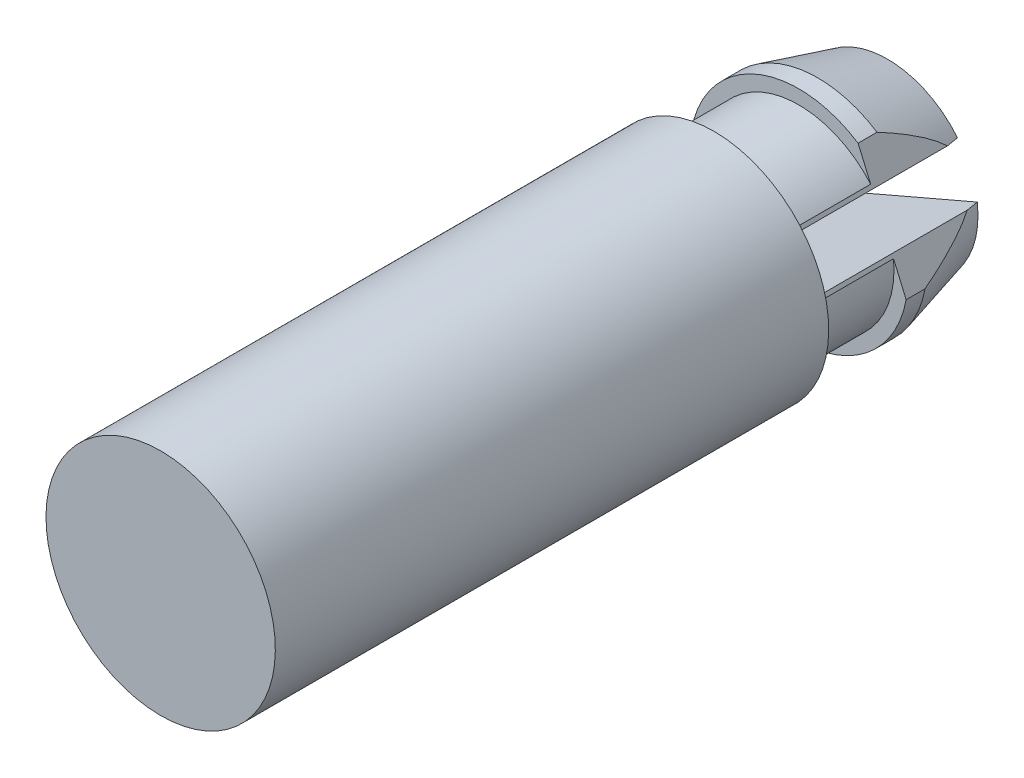
ISO-10303-21;
HEADER;
FILE_DESCRIPTION(('STEP AP214'),'2;1');
FILE_NAME('part.step','',(''),(''),'','','');
FILE_SCHEMA(('AUTOMOTIVE_DESIGN { 1 0 10303 214 1 1 1 1 }'));
ENDSEC;
DATA;
#1=APPLICATION_CONTEXT('core data for automotive mechanical design processes');
#2=APPLICATION_PROTOCOL_DEFINITION('international standard','automotive_design',2000,#1);
#3=PRODUCT_CONTEXT('',#1,'mechanical');
#4=PRODUCT('Part','Part','',(#3));
#5=PRODUCT_RELATED_PRODUCT_CATEGORY('part','',(#4));
#6=PRODUCT_DEFINITION_FORMATION('','',#4);
#7=PRODUCT_DEFINITION_CONTEXT('part definition',#1,'design');
#8=PRODUCT_DEFINITION('design','',#6,#7);
#9=PRODUCT_DEFINITION_SHAPE('','',#8);
#10=(LENGTH_UNIT() NAMED_UNIT(*) SI_UNIT(.MILLI.,.METRE.));
#11=(NAMED_UNIT(*) PLANE_ANGLE_UNIT() SI_UNIT($,.RADIAN.));
#12=(NAMED_UNIT(*) SI_UNIT($,.STERADIAN.) SOLID_ANGLE_UNIT());
#13=UNCERTAINTY_MEASURE_WITH_UNIT(LENGTH_MEASURE(1.E-05),#10,'distance_accuracy_value','');
#14=(GEOMETRIC_REPRESENTATION_CONTEXT(3) GLOBAL_UNCERTAINTY_ASSIGNED_CONTEXT((#13)) GLOBAL_UNIT_ASSIGNED_CONTEXT((#10,
#11,#12)) REPRESENTATION_CONTEXT('',''));
#15=CARTESIAN_POINT('',(0.,0.,0.));
#16=DIRECTION('',(0.,0.,1.));
#17=DIRECTION('',(1.,0.,0.));
#18=AXIS2_PLACEMENT_3D('',#15,#16,#17);
#19=CARTESIAN_POINT('',(73.0951711620178,71.9465523601488,37.7358601149983));
#20=DIRECTION('',(0.,0.,1.));
#21=DIRECTION('',(1.,0.,0.));
#22=AXIS2_PLACEMENT_3D('',#19,#20,#21);
#23=PLANE('',#22);
#24=CARTESIAN_POINT('',(74.3116465105009,75.0052499991012,37.7358601149983));
#25=DIRECTION('',(0.,0.,1.));
#26=DIRECTION('',(0.918365051433991,0.395734295082752,0.));
#27=AXIS2_PLACEMENT_3D('',#24,#25,#26);
#28=CIRCLE('',#27,1.91);
#29=CARTESIAN_POINT('',(75.7537839423966,76.2575836718213,37.7358601149983));
#30=VERTEX_POINT('',#29);
#31=CARTESIAN_POINT('',(72.4109351551768,74.8171108377201,37.7358601149983));
#32=VERTEX_POINT('',#31);
#33=EDGE_CURVE('E240',#30,#32,#28,.T.);
#34=ORIENTED_EDGE('',*,*,#33,.T.);
#35=DIRECTION('',(0.395734295082752,-0.918365051433991,0.));
#36=VECTOR('',#35,1.);
#37=CARTESIAN_POINT('',(73.3417941705216,72.6569028443085,37.7358601149983));
#38=LINE('',#37,#36);
#39=CARTESIAN_POINT('',(72.8695090786053,73.7529163263811,37.7358601149983));
#40=VERTEX_POINT('',#39);
#41=EDGE_CURVE('E183',#32,#40,#38,.T.);
#42=ORIENTED_EDGE('',*,*,#41,.T.);
#43=CARTESIAN_POINT('',(74.3116465105009,75.0052499991012,37.7358601149983));
#44=DIRECTION('',(0.,0.,1.));
#45=DIRECTION('',(0.918365051433991,0.395734295082752,0.));
#46=AXIS2_PLACEMENT_3D('',#43,#44,#45);
#47=CIRCLE('',#46,1.91);
#48=CARTESIAN_POINT('',(76.2123578658251,75.1933891604823,37.7358601149983));
#49=VERTEX_POINT('',#48);
#50=EDGE_CURVE('E219',#40,#49,#47,.T.);
#51=ORIENTED_EDGE('',*,*,#50,.T.);
#52=DIRECTION('',(-0.395734295082752,0.918365051433991,0.));
#53=VECTOR('',#52,1.);
#54=CARTESIAN_POINT('',(76.6846429577413,74.0973756784097,37.7358601149983));
#55=LINE('',#54,#53);
#56=EDGE_CURVE('E159',#49,#30,#55,.T.);
#57=ORIENTED_EDGE('',*,*,#56,.T.);
#58=EDGE_LOOP('',(#34,#42,#51,#57));
#59=FACE_BOUND('',#58,.T.);
#60=CARTESIAN_POINT('',(74.3116465105009,75.0052499991012,37.7358601149983));
#61=DIRECTION('',(0.,0.,-1.));
#62=DIRECTION('',(-0.918365051433992,-0.395734295082751,0.));
#63=AXIS2_PLACEMENT_3D('',#60,#61,#62);
#64=CIRCLE('',#63,2.3);
#65=CARTESIAN_POINT('',(76.4238861287991,75.9154388777915,37.7358601149983));
#66=VERTEX_POINT('',#65);
#67=EDGE_CURVE('E11',#66,#66,#64,.T.);
#68=ORIENTED_EDGE('',*,*,#67,.T.);
#69=EDGE_LOOP('',(#68));
#70=FACE_BOUND('',#69,.T.);
#71=ADVANCED_FACE('F17',(#59,#70),#23,.F.);
#72=CARTESIAN_POINT('',(73.0951711620179,71.946552360149,48.8358601149984));
#73=DIRECTION('',(0.,0.,1.));
#74=DIRECTION('',(1.,0.,0.));
#75=AXIS2_PLACEMENT_3D('',#72,#73,#74);
#76=PLANE('',#75);
#77=CARTESIAN_POINT('',(74.3116465105011,75.0052499991013,48.8358601149983));
#78=DIRECTION('',(0.,0.,1.));
#79=DIRECTION('',(-0.918365051433992,-0.395734295082751,0.));
#80=AXIS2_PLACEMENT_3D('',#77,#78,#79);
#81=CIRCLE('',#80,2.3);
#82=CARTESIAN_POINT('',(76.4238861287993,75.9154388777917,48.8358601149983));
#83=VERTEX_POINT('',#82);
#84=EDGE_CURVE('E28',#83,#83,#81,.T.);
#85=ORIENTED_EDGE('',*,*,#84,.T.);
#86=EDGE_LOOP('',(#85));
#87=FACE_BOUND('',#86,.T.);
#88=ADVANCED_FACE('F595',(#87),#76,.T.);
#89=CARTESIAN_POINT('',(74.3116465105011,75.0052499991013,48.8358601149983));
#90=DIRECTION('',(0.,0.,-1.));
#91=DIRECTION('',(-0.918365051433992,-0.395734295082751,0.));
#92=AXIS2_PLACEMENT_3D('',#89,#90,#91);
#93=CYLINDRICAL_SURFACE('',#92,2.3);
#94=ORIENTED_EDGE('',*,*,#67,.F.);
#95=EDGE_LOOP('',(#94));
#96=FACE_BOUND('',#95,.T.);
#97=ORIENTED_EDGE('',*,*,#84,.F.);
#98=EDGE_LOOP('',(#97));
#99=FACE_BOUND('',#98,.T.);
#100=ADVANCED_FACE('F554',(#96,#99),#93,.T.);
#101=CARTESIAN_POINT('',(75.864350615586,76.000995931582,37.5258601149983));
#102=DIRECTION('',(-0.918365051433991,-0.395734295082752,0.));
#103=DIRECTION('',(0.,0.,1.));
#104=AXIS2_PLACEMENT_3D('',#101,#102,#103);
#105=CYLINDRICAL_SURFACE('',#104,0.2);
#106=DIRECTION('',(-0.918365051433992,-0.395734295082751,0.));
#107=VECTOR('',#106,1.);
#108=CARTESIAN_POINT('',(74.1929262219761,75.2807595145314,37.7258601149983));
#109=LINE('',#108,#107);
#110=CARTESIAN_POINT('',(75.864350615586,76.000995931582,37.7258601149983));
#111=VERTEX_POINT('',#110);
#112=CARTESIAN_POINT('',(72.5215018283663,74.5605230974808,37.7258601149983));
#113=VERTEX_POINT('',#112);
#114=EDGE_CURVE('E125',#111,#113,#109,.T.);
#115=ORIENTED_EDGE('',*,*,#114,.T.);
#116=CARTESIAN_POINT('',(72.5215018283663,74.5605230974808,37.5258601149983));
#117=DIRECTION('',(-0.918365051433991,-0.395734295082752,0.));
#118=DIRECTION('',(0.,0.,1.));
#119=AXIS2_PLACEMENT_3D('',#116,#117,#118);
#120=CIRCLE('',#119,0.2);
#121=CARTESIAN_POINT('',(72.4423549695549,74.7441961072913,37.5258601149983));
#122=VERTEX_POINT('',#121);
#123=EDGE_CURVE('E147',#113,#122,#120,.T.);
#124=ORIENTED_EDGE('',*,*,#123,.T.);
#125=DIRECTION('',(0.918365051433992,0.395734295082751,0.));
#126=VECTOR('',#125,1.);
#127=CARTESIAN_POINT('',(74.1137793629596,75.4644325248182,37.5258601149983));
#128=LINE('',#127,#126);
#129=CARTESIAN_POINT('',(75.7852037567746,76.1846689413926,37.5258601149983));
#130=VERTEX_POINT('',#129);
#131=EDGE_CURVE('E21',#122,#130,#128,.T.);
#132=ORIENTED_EDGE('',*,*,#131,.T.);
#133=CARTESIAN_POINT('',(75.864350615586,76.000995931582,37.5258601149983));
#134=DIRECTION('',(0.918365051433991,0.395734295082752,0.));
#135=DIRECTION('',(0.,0.,1.));
#136=AXIS2_PLACEMENT_3D('',#133,#134,#135);
#137=CIRCLE('',#136,0.2);
#138=EDGE_CURVE('E327',#130,#111,#137,.T.);
#139=ORIENTED_EDGE('',*,*,#138,.T.);
#140=EDGE_LOOP('',(#115,#124,#132,#139));
#141=FACE_BOUND('',#140,.T.);
#142=ADVANCED_FACE('F148',(#141),#105,.F.);
#143=CARTESIAN_POINT('',(76.1017911926356,75.4499769007216,37.7258601149983));
#144=DIRECTION('',(0.,0.,1.));
#145=DIRECTION('',(1.,0.,0.));
#146=AXIS2_PLACEMENT_3D('',#143,#144,#145);
#147=PLANE('',#146);
#148=DIRECTION('',(-0.395734295082751,0.918365051433992,0.));
#149=VECTOR('',#148,1.);
#150=CARTESIAN_POINT('',(75.9830709041108,75.7254864161518,37.7258601149983));
#151=LINE('',#150,#149);
#152=CARTESIAN_POINT('',(76.1017911926509,75.4499769006863,37.7258601149983));
#153=VERTEX_POINT('',#152);
#154=EDGE_CURVE('E323',#153,#111,#151,.T.);
#155=ORIENTED_EDGE('',*,*,#154,.F.);
#156=DIRECTION('',(0.918365051433992,0.395734295082751,0.));
#157=VECTOR('',#156,1.);
#158=CARTESIAN_POINT('',(74.4303667990562,74.7297404836004,37.7258601149983));
#159=LINE('',#158,#157);
#160=CARTESIAN_POINT('',(72.7589424054311,74.0095040665851,37.7258601149983));
#161=VERTEX_POINT('',#160);
#162=EDGE_CURVE('E244',#161,#153,#159,.T.);
#163=ORIENTED_EDGE('',*,*,#162,.F.);
#164=DIRECTION('',(0.395734295082751,-0.918365051433992,0.));
#165=VECTOR('',#164,1.);
#166=CARTESIAN_POINT('',(72.6402221168911,74.2850135820506,37.7258601149983));
#167=LINE('',#166,#165);
#168=EDGE_CURVE('E152',#113,#161,#167,.T.);
#169=ORIENTED_EDGE('',*,*,#168,.F.);
#170=ORIENTED_EDGE('',*,*,#114,.F.);
#171=EDGE_LOOP('',(#155,#163,#169,#170));
#172=FACE_BOUND('',#171,.T.);
#173=ADVANCED_FACE('F437',(#172),#147,.F.);
#174=CARTESIAN_POINT('',(75.7852037565694,76.1846689418688,37.5258601149983));
#175=DIRECTION('',(-0.395734295082752,0.918365051433991,0.));
#176=DIRECTION('',(0.,0.,1.));
#177=AXIS2_PLACEMENT_3D('',#174,#175,#176);
#178=PLANE('',#177);
#179=CARTESIAN_POINT('',(75.7852037570063,76.1846689414923,34.5266614071802));
#180=CARTESIAN_POINT('',(75.7621657782217,76.1747416062115,34.436384510564));
#181=CARTESIAN_POINT('',(75.7390968250467,76.1648009231369,34.3461169774079));
#182=CARTESIAN_POINT('',(75.7159927375387,76.1548451002654,34.2558601148737));
#183=(BOUNDED_CURVE() B_SPLINE_CURVE(3,(#179,#180,#181,#182),.UNSPECIFIED.,.F.,
.F.) B_SPLINE_CURVE_WITH_KNOTS((4,4),(9.03997541306872E-13,0.00028109245218172),
.UNSPECIFIED.) CURVE() GEOMETRIC_REPRESENTATION_ITEM() RATIONAL_B_SPLINE_CURVE((1.,1.,1.,1.)) REPRESENTATION_ITEM(''));
#184=CARTESIAN_POINT('',(75.7852037567647,76.184668941628,34.5266614067923));
#185=VERTEX_POINT('',#184);
#186=CARTESIAN_POINT('',(75.7159927375387,76.1548451002654,34.2558601148737));
#187=VERTEX_POINT('',#186);
#188=EDGE_CURVE('E201',#185,#187,#183,.T.);
#189=ORIENTED_EDGE('',*,*,#188,.F.);
#190=DIRECTION('',(0.,0.,1.));
#191=VECTOR('',#190,1.);
#192=CARTESIAN_POINT('',(75.7852037569799,76.1846689409163,36.1216331644983));
#193=LINE('',#192,#191);
#194=EDGE_CURVE('E142',#185,#130,#193,.T.);
#195=ORIENTED_EDGE('',*,*,#194,.T.);
#196=ORIENTED_EDGE('',*,*,#131,.F.);
#197=DIRECTION('',(0.,0.,-1.));
#198=VECTOR('',#197,1.);
#199=CARTESIAN_POINT('',(72.4423549697601,74.7441961068151,36.1216331644983));
#200=LINE('',#199,#198);
#201=CARTESIAN_POINT('',(72.4423549693934,74.7441961074523,34.5266614067876));
#202=VERTEX_POINT('',#201);
#203=EDGE_CURVE('E139',#122,#202,#200,.T.);
#204=ORIENTED_EDGE('',*,*,#203,.T.);
#205=CARTESIAN_POINT('',(72.511565988379,74.7740199493704,34.255860114879));
#206=CARTESIAN_POINT('',(72.4884619012034,74.764064126303,34.3461169774823));
#207=CARTESIAN_POINT('',(72.4653929476946,74.7541234434237,34.4363845105746));
#208=CARTESIAN_POINT('',(72.4423549693219,74.7441961071909,34.5266614071856));
#209=(BOUNDED_CURVE() B_SPLINE_CURVE(3,(#205,#206,#207,#208),.UNSPECIFIED.,.F.,
.F.) B_SPLINE_CURVE_WITH_KNOTS((4,4),(1.23741821726329E-13,0.00028109245138149),
.UNSPECIFIED.) CURVE() GEOMETRIC_REPRESENTATION_ITEM() RATIONAL_B_SPLINE_CURVE((1.,1.,1.,1.)) REPRESENTATION_ITEM(''));
#210=CARTESIAN_POINT('',(72.511565988379,74.7740199493704,34.255860114879));
#211=VERTEX_POINT('',#210);
#212=EDGE_CURVE('E278',#211,#202,#209,.T.);
#213=ORIENTED_EDGE('',*,*,#212,.F.);
#214=DIRECTION('',(-0.918365051433992,-0.395734295082751,0.));
#215=VECTOR('',#214,1.);
#216=CARTESIAN_POINT('',(74.1137793629595,75.4644325248182,34.2558601149983));
#217=LINE('',#216,#215);
#218=EDGE_CURVE('E145',#187,#211,#217,.T.);
#219=ORIENTED_EDGE('',*,*,#218,.F.);
#220=EDGE_LOOP('',(#189,#195,#196,#204,#213,#219));
#221=FACE_BOUND('',#220,.T.);
#222=ADVANCED_FACE('F136',(#221),#178,.F.);
#223=CARTESIAN_POINT('',(75.7352192976308,76.1631300509971,34.2558601149983));
#224=DIRECTION('',(0.,0.,-1.));
#225=DIRECTION('',(-1.,0.,0.));
#226=AXIS2_PLACEMENT_3D('',#223,#224,#225);
#227=PLANE('',#226);
#228=CARTESIAN_POINT('',(74.3116465105009,75.0052499991012,34.2558601149983));
#229=DIRECTION('',(0.,0.,-1.));
#230=DIRECTION('',(0.918365051433992,0.395734295082751,0.));
#231=AXIS2_PLACEMENT_3D('',#228,#229,#230);
#232=CIRCLE('',#231,1.814871131);
#233=EDGE_CURVE('E225',#211,#187,#232,.T.);
#234=ORIENTED_EDGE('',*,*,#233,.T.);
#235=ORIENTED_EDGE('',*,*,#218,.T.);
#236=EDGE_LOOP('',(#234,#235));
#237=FACE_BOUND('',#236,.T.);
#238=ADVANCED_FACE('F536',(#237),#227,.T.);
#239=CARTESIAN_POINT('',(76.1017911926356,75.4499769007216,37.5258601149983));
#240=DIRECTION('',(-0.918365051433991,-0.395734295082752,0.));
#241=DIRECTION('',(0.,0.,1.));
#242=AXIS2_PLACEMENT_3D('',#239,#240,#241);
#243=CYLINDRICAL_SURFACE('',#242,0.2);
#244=DIRECTION('',(-0.918365051433992,-0.395734295082751,0.));
#245=VECTOR('',#244,1.);
#246=CARTESIAN_POINT('',(74.5095136580423,74.5460674733842,37.5258601149983));
#247=LINE('',#246,#245);
#248=CARTESIAN_POINT('',(76.1809380516522,75.2663038904348,37.5258601149983));
#249=VERTEX_POINT('',#248);
#250=CARTESIAN_POINT('',(72.8380892644325,73.8258310563336,37.5258601149983));
#251=VERTEX_POINT('',#250);
#252=EDGE_CURVE('E193',#249,#251,#247,.T.);
#253=ORIENTED_EDGE('',*,*,#252,.T.);
#254=CARTESIAN_POINT('',(72.7589424054159,74.0095040666204,37.5258601149983));
#255=DIRECTION('',(-0.918365051433991,-0.395734295082752,0.));
#256=DIRECTION('',(0.,0.,1.));
#257=AXIS2_PLACEMENT_3D('',#254,#255,#256);
#258=CIRCLE('',#257,0.2);
#259=EDGE_CURVE('E179',#251,#161,#258,.T.);
#260=ORIENTED_EDGE('',*,*,#259,.T.);
#261=ORIENTED_EDGE('',*,*,#162,.T.);
#262=CARTESIAN_POINT('',(76.1017911926356,75.4499769007216,37.5258601149983));
#263=DIRECTION('',(0.918365051433991,0.395734295082752,0.));
#264=DIRECTION('',(0.,0.,1.));
#265=AXIS2_PLACEMENT_3D('',#262,#263,#264);
#266=CIRCLE('',#265,0.2);
#267=EDGE_CURVE('E328',#153,#249,#266,.T.);
#268=ORIENTED_EDGE('',*,*,#267,.T.);
#269=EDGE_LOOP('',(#253,#260,#261,#268));
#270=FACE_BOUND('',#269,.T.);
#271=ADVANCED_FACE('F434',(#270),#243,.F.);
#272=CARTESIAN_POINT('',(73.1222550789175,73.1663786002841,37.7358601149983));
#273=DIRECTION('',(0.918365051433991,0.395734295082752,0.));
#274=DIRECTION('',(0.,0.,-1.));
#275=AXIS2_PLACEMENT_3D('',#272,#273,#274);
#276=PLANE('',#275);
#277=CARTESIAN_POINT('',(72.1581891548225,75.4036485639151,35.6558601142926));
#278=CARTESIAN_POINT('',(72.3108153948691,75.0494548371335,34.8552851618377));
#279=CARTESIAN_POINT('',(72.4423549690983,74.744196108351,34.5266614059917));
#280=(BOUNDED_CURVE() B_SPLINE_CURVE(2,(#277,#278,#279),.UNSPECIFIED.,.F.,
.F.) B_SPLINE_CURVE_WITH_KNOTS((3,3),(0.197149228097952,0.369287785765568),
.UNSPECIFIED.) CURVE() GEOMETRIC_REPRESENTATION_ITEM() RATIONAL_B_SPLINE_CURVE((1.20580636210175,
1.27395615809123,1.30421363296841)) REPRESENTATION_ITEM(''));
#281=CARTESIAN_POINT('',(72.1581891548646,75.4036485638171,35.655860114344));
#282=VERTEX_POINT('',#281);
#283=EDGE_CURVE('E156',#282,#202,#280,.T.);
#284=ORIENTED_EDGE('',*,*,#283,.T.);
#285=ORIENTED_EDGE('',*,*,#203,.F.);
#286=ORIENTED_EDGE('',*,*,#123,.F.);
#287=ORIENTED_EDGE('',*,*,#168,.T.);
#288=ORIENTED_EDGE('',*,*,#259,.F.);
#289=DIRECTION('',(0.,0.,-1.));
#290=VECTOR('',#289,1.);
#291=CARTESIAN_POINT('',(72.8380892644324,73.8258310563336,35.8908601149983));
#292=LINE('',#291,#290);
#293=CARTESIAN_POINT('',(72.8380892646062,73.8258310559302,34.526661405798));
#294=VERTEX_POINT('',#293);
#295=EDGE_CURVE('E205',#251,#294,#292,.T.);
#296=ORIENTED_EDGE('',*,*,#295,.T.);
#297=CARTESIAN_POINT('',(73.1222550790085,73.1663786000729,35.6558601145482));
#298=CARTESIAN_POINT('',(72.9696288388929,73.5205723270142,34.8552851616767));
#299=CARTESIAN_POINT('',(72.838089264612,73.8258310559169,34.5266614058123));
#300=(BOUNDED_CURVE() B_SPLINE_CURVE(2,(#297,#298,#299),.UNSPECIFIED.,.F.,
.F.) B_SPLINE_CURVE_WITH_KNOTS((3,3),(-0.81633576723133,-0.644197209523718),
.UNSPECIFIED.) CURVE() GEOMETRIC_REPRESENTATION_ITEM() RATIONAL_B_SPLINE_CURVE((1.20580636208115,
1.27395615810571,1.30421363298533)) REPRESENTATION_ITEM(''));
#301=CARTESIAN_POINT('',(73.1222550794408,73.1663785997977,35.6558601143441));
#302=VERTEX_POINT('',#301);
#303=EDGE_CURVE('E301',#302,#294,#300,.T.);
#304=ORIENTED_EDGE('',*,*,#303,.F.);
#305=DIRECTION('',(0.,0.,-1.));
#306=VECTOR('',#305,1.);
#307=CARTESIAN_POINT('',(73.1222550789175,73.1663786002841,36.1216331644983));
#308=LINE('',#307,#306);
#309=CARTESIAN_POINT('',(73.1222550790059,73.166378600079,36.0358601147895));
#310=VERTEX_POINT('',#309);
#311=EDGE_CURVE('E173',#310,#302,#308,.T.);
#312=ORIENTED_EDGE('',*,*,#311,.F.);
#313=DIRECTION('',(0.395734295082751,-0.918365051433992,0.));
#314=VECTOR('',#313,1.);
#315=CARTESIAN_POINT('',(72.6402221168911,74.2850135820506,36.0358601145807));
#316=LINE('',#315,#314);
#317=CARTESIAN_POINT('',(72.8695090786053,73.7529163263811,36.0358601147895));
#318=VERTEX_POINT('',#317);
#319=EDGE_CURVE('E295',#318,#310,#316,.T.);
#320=ORIENTED_EDGE('',*,*,#319,.F.);
#321=DIRECTION('',(0.,0.,-1.));
#322=VECTOR('',#321,1.);
#323=CARTESIAN_POINT('',(72.8695090787088,73.7529163261408,36.1216331644983));
#324=LINE('',#323,#322);
#325=EDGE_CURVE('E232',#40,#318,#324,.T.);
#326=ORIENTED_EDGE('',*,*,#325,.F.);
#327=ORIENTED_EDGE('',*,*,#41,.F.);
#328=DIRECTION('',(0.,0.,1.));
#329=VECTOR('',#328,1.);
#330=CARTESIAN_POINT('',(72.4109351550733,74.8171108379604,36.1216331644983));
#331=LINE('',#330,#329);
#332=CARTESIAN_POINT('',(72.4109351551768,74.8171108377201,36.0358601147895));
#333=VERTEX_POINT('',#332);
#334=EDGE_CURVE('E237',#333,#32,#331,.T.);
#335=ORIENTED_EDGE('',*,*,#334,.F.);
#336=DIRECTION('',(0.395734295082751,-0.918365051433992,0.));
#337=VECTOR('',#336,1.);
#338=CARTESIAN_POINT('',(72.6402221168911,74.2850135820506,36.0358601145807));
#339=LINE('',#338,#337);
#340=CARTESIAN_POINT('',(72.1581891547763,75.4036485640222,36.0358601147895));
#341=VERTEX_POINT('',#340);
#342=EDGE_CURVE('E315',#341,#333,#339,.T.);
#343=ORIENTED_EDGE('',*,*,#342,.F.);
#344=DIRECTION('',(0.,0.,1.));
#345=VECTOR('',#344,1.);
#346=CARTESIAN_POINT('',(72.1581891548646,75.4036485638171,36.1216331644983));
#347=LINE('',#346,#345);
#348=EDGE_CURVE('E249',#282,#341,#347,.T.);
#349=ORIENTED_EDGE('',*,*,#348,.F.);
#350=EDGE_LOOP('',(#284,#285,#286,#287,#288,#296,#304,#312,#320,#326,#327,#335,#343,#349));
#351=FACE_BOUND('',#350,.T.);
#352=ADVANCED_FACE('F154',(#351),#276,.F.);
#353=CARTESIAN_POINT('',(76.4651038661372,74.6068514343853,34.5074062139983));
#354=DIRECTION('',(-0.918365051433991,-0.395734295082752,0.));
#355=DIRECTION('',(-0.395734295082752,0.918365051433991,0.));
#356=AXIS2_PLACEMENT_3D('',#353,#354,#355);
#357=PLANE('',#356);
#358=CARTESIAN_POINT('',(76.1809380520193,75.2663038895828,34.5266614062808));
#359=CARTESIAN_POINT('',(76.3124776262118,74.9610451608854,34.8552851622139));
#360=CARTESIAN_POINT('',(76.465103866213,74.6068514342095,35.6558601144686));
#361=(BOUNDED_CURVE() B_SPLINE_CURVE(2,(#358,#359,#360),.UNSPECIFIED.,.F.,
.F.) B_SPLINE_CURVE_WITH_KNOTS((3,3),(-0.36928778563948,-0.197149228080047),
.UNSPECIFIED.) CURVE() GEOMETRIC_REPRESENTATION_ITEM() RATIONAL_B_SPLINE_CURVE((1.30421363294116,
1.27395615805739,1.20580636208757)) REPRESENTATION_ITEM(''));
#362=CARTESIAN_POINT('',(76.1809380520823,75.2663038901437,34.5266614068034));
#363=VERTEX_POINT('',#362);
#364=CARTESIAN_POINT('',(76.4651038661413,74.6068514343759,35.6558601145559));
#365=VERTEX_POINT('',#364);
#366=EDGE_CURVE('E261',#363,#365,#361,.T.);
#367=ORIENTED_EDGE('',*,*,#366,.F.);
#368=DIRECTION('',(0.,0.,1.));
#369=VECTOR('',#368,1.);
#370=CARTESIAN_POINT('',(76.1809380516522,75.2663038904348,35.8908601149983));
#371=LINE('',#370,#369);
#372=EDGE_CURVE('E189',#363,#249,#371,.T.);
#373=ORIENTED_EDGE('',*,*,#372,.T.);
#374=ORIENTED_EDGE('',*,*,#267,.F.);
#375=ORIENTED_EDGE('',*,*,#154,.T.);
#376=ORIENTED_EDGE('',*,*,#138,.F.);
#377=ORIENTED_EDGE('',*,*,#194,.F.);
#378=CARTESIAN_POINT('',(75.785203756308,76.1846689424753,34.5266614060166));
#379=CARTESIAN_POINT('',(75.6536641820832,76.4899276712477,34.8552851618671));
#380=CARTESIAN_POINT('',(75.5010379420421,76.8441213980163,35.6558601142925));
#381=(BOUNDED_CURVE() B_SPLINE_CURVE(2,(#378,#379,#380),.UNSPECIFIED.,.F.,
.F.) B_SPLINE_CURVE_WITH_KNOTS((3,3),(0.644197209637491,0.816335767205345),
.UNSPECIFIED.) CURVE() GEOMETRIC_REPRESENTATION_ITEM() RATIONAL_B_SPLINE_CURVE((1.30421363296606,
1.27395615808858,1.20580636210175)) REPRESENTATION_ITEM(''));
#382=CARTESIAN_POINT('',(75.5010379420844,76.8441213979183,35.655860114344));
#383=VERTEX_POINT('',#382);
#384=EDGE_CURVE('E192',#185,#383,#381,.T.);
#385=ORIENTED_EDGE('',*,*,#384,.T.);
#386=DIRECTION('',(0.,0.,-1.));
#387=VECTOR('',#386,1.);
#388=CARTESIAN_POINT('',(75.5010379420844,76.8441213979183,36.1216331644983));
#389=LINE('',#388,#387);
#390=CARTESIAN_POINT('',(75.501037941996,76.8441213981234,36.0358601147895));
#391=VERTEX_POINT('',#390);
#392=EDGE_CURVE('E213',#391,#383,#389,.T.);
#393=ORIENTED_EDGE('',*,*,#392,.F.);
#394=DIRECTION('',(-0.395734295082751,0.918365051433992,0.));
#395=VECTOR('',#394,1.);
#396=CARTESIAN_POINT('',(75.9830709041108,75.7254864161518,36.0358601145807));
#397=LINE('',#396,#395);
#398=CARTESIAN_POINT('',(75.7537839423966,76.2575836718213,36.0358601147895));
#399=VERTEX_POINT('',#398);
#400=EDGE_CURVE('E187',#399,#391,#397,.T.);
#401=ORIENTED_EDGE('',*,*,#400,.F.);
#402=DIRECTION('',(0.,0.,-1.));
#403=VECTOR('',#402,1.);
#404=CARTESIAN_POINT('',(75.753783942293,76.2575836720616,36.1216331644983));
#405=LINE('',#404,#403);
#406=EDGE_CURVE('E178',#30,#399,#405,.T.);
#407=ORIENTED_EDGE('',*,*,#406,.F.);
#408=ORIENTED_EDGE('',*,*,#56,.F.);
#409=DIRECTION('',(0.,0.,1.));
#410=VECTOR('',#409,1.);
#411=CARTESIAN_POINT('',(76.2123578659286,75.193389160242,36.1216331644983));
#412=LINE('',#411,#410);
#413=CARTESIAN_POINT('',(76.212357865825,75.1933891604823,36.0358601147895));
#414=VERTEX_POINT('',#413);
#415=EDGE_CURVE('E216',#414,#49,#412,.T.);
#416=ORIENTED_EDGE('',*,*,#415,.F.);
#417=DIRECTION('',(-0.395734295082751,0.918365051433992,0.));
#418=VECTOR('',#417,1.);
#419=CARTESIAN_POINT('',(75.9830709041108,75.7254864161518,36.0358601145807));
#420=LINE('',#419,#418);
#421=CARTESIAN_POINT('',(76.4651038662256,74.6068514341802,36.0358601147895));
#422=VERTEX_POINT('',#421);
#423=EDGE_CURVE('E277',#422,#414,#420,.T.);
#424=ORIENTED_EDGE('',*,*,#423,.F.);
#425=DIRECTION('',(0.,0.,1.));
#426=VECTOR('',#425,1.);
#427=CARTESIAN_POINT('',(76.4651038661372,74.6068514343853,36.1216331644983));
#428=LINE('',#427,#426);
#429=EDGE_CURVE('E170',#365,#422,#428,.T.);
#430=ORIENTED_EDGE('',*,*,#429,.F.);
#431=EDGE_LOOP('',(#367,#373,#374,#375,#376,#377,#385,#393,#401,#407,#408,#416,#424,#430));
#432=FACE_BOUND('',#431,.T.);
#433=ADVANCED_FACE('F384',(#432),#357,.F.);
#434=CARTESIAN_POINT('',(74.3116465105009,75.0052499991012,34.2558601149983));
#435=DIRECTION('',(0.,0.,1.));
#436=DIRECTION('',(0.918365051433991,0.395734295082752,0.));
#437=AXIS2_PLACEMENT_3D('',#434,#435,#436);
#438=CONICAL_SURFACE('',#437,1.814871131,0.261799387530194);
#439=CARTESIAN_POINT('',(74.3116465105009,75.0052499991012,35.6558601149983));
#440=DIRECTION('',(0.,0.,-1.));
#441=DIRECTION('',(0.918365051433991,0.395734295082752,0.));
#442=AXIS2_PLACEMENT_3D('',#439,#440,#441);
#443=CIRCLE('',#442,2.19);
#444=EDGE_CURVE('E262',#282,#383,#443,.T.);
#445=ORIENTED_EDGE('',*,*,#444,.T.);
#446=ORIENTED_EDGE('',*,*,#384,.F.);
#447=ORIENTED_EDGE('',*,*,#188,.T.);
#448=ORIENTED_EDGE('',*,*,#233,.F.);
#449=ORIENTED_EDGE('',*,*,#212,.T.);
#450=ORIENTED_EDGE('',*,*,#283,.F.);
#451=EDGE_LOOP('',(#445,#446,#447,#448,#449,#450));
#452=FACE_BOUND('',#451,.T.);
#453=ADVANCED_FACE('F564',(#452),#438,.T.);
#454=CARTESIAN_POINT('',(76.1809380516522,75.2663038904348,37.5258601149983));
#455=DIRECTION('',(0.395734295082752,-0.918365051433991,0.));
#456=DIRECTION('',(0.,0.,-1.));
#457=AXIS2_PLACEMENT_3D('',#454,#455,#456);
#458=PLANE('',#457);
#459=CARTESIAN_POINT('',(76.1117270326242,75.2364800488325,34.2558601148843));
#460=CARTESIAN_POINT('',(76.13483112015,75.2464358717118,34.3461169774882));
#461=CARTESIAN_POINT('',(76.1579000733402,75.2563765547929,34.4363845107036));
#462=CARTESIAN_POINT('',(76.1809380520823,75.2663038901437,34.5266614068034));
#463=(BOUNDED_CURVE() B_SPLINE_CURVE(3,(#459,#460,#461,#462),.UNSPECIFIED.,.F.,
.F.) B_SPLINE_CURVE_WITH_KNOTS((4,4),(1.18331367547941E-13,0.000281092451866944),
.UNSPECIFIED.) CURVE() GEOMETRIC_REPRESENTATION_ITEM() RATIONAL_B_SPLINE_CURVE((1.,1.,1.,1.)) REPRESENTATION_ITEM(''));
#464=CARTESIAN_POINT('',(76.1117270326242,75.2364800488325,34.2558601148843));
#465=VERTEX_POINT('',#464);
#466=EDGE_CURVE('E255',#465,#363,#463,.T.);
#467=ORIENTED_EDGE('',*,*,#466,.F.);
#468=DIRECTION('',(0.918365051433992,0.395734295082751,0.));
#469=VECTOR('',#468,1.);
#470=CARTESIAN_POINT('',(74.5095136580423,74.5460674733842,34.2558601149983));
#471=LINE('',#470,#469);
#472=CARTESIAN_POINT('',(72.9073002834612,73.8556548979361,34.2558601148814));
#473=VERTEX_POINT('',#472);
#474=EDGE_CURVE('E269',#473,#465,#471,.T.);
#475=ORIENTED_EDGE('',*,*,#474,.F.);
#476=CARTESIAN_POINT('',(72.8380892646062,73.8258310559302,34.526661405798));
#477=CARTESIAN_POINT('',(72.8611272427449,73.8357583919757,34.4363845107017));
#478=CARTESIAN_POINT('',(72.8841961959356,73.845699075057,34.3461169774843));
#479=CARTESIAN_POINT('',(72.9073002834612,73.8556548979361,34.2558601148814));
#480=(BOUNDED_CURVE() B_SPLINE_CURVE(3,(#476,#477,#478,#479),.UNSPECIFIED.,.F.,
.F.) B_SPLINE_CURVE_WITH_KNOTS((4,4),(1.67231178372158E-12,0.00028109245238031),
.UNSPECIFIED.) CURVE() GEOMETRIC_REPRESENTATION_ITEM() RATIONAL_B_SPLINE_CURVE((1.,1.,1.,1.)) REPRESENTATION_ITEM(''));
#481=EDGE_CURVE('E188',#294,#473,#480,.T.);
#482=ORIENTED_EDGE('',*,*,#481,.F.);
#483=ORIENTED_EDGE('',*,*,#295,.F.);
#484=ORIENTED_EDGE('',*,*,#252,.F.);
#485=ORIENTED_EDGE('',*,*,#372,.F.);
#486=EDGE_LOOP('',(#467,#475,#482,#483,#484,#485));
#487=FACE_BOUND('',#486,.T.);
#488=ADVANCED_FACE('F382',(#487),#458,.F.);
#489=CARTESIAN_POINT('',(74.3116465105009,75.0052499991012,35.6558601149983));
#490=DIRECTION('',(0.,0.,1.));
#491=DIRECTION('',(0.918365051433992,0.395734295082751,0.));
#492=AXIS2_PLACEMENT_3D('',#489,#490,#491);
#493=CYLINDRICAL_SURFACE('',#492,2.19);
#494=ORIENTED_EDGE('',*,*,#444,.F.);
#495=ORIENTED_EDGE('',*,*,#348,.T.);
#496=CARTESIAN_POINT('',(74.3116465105009,75.0052499991012,36.0358601149983));
#497=DIRECTION('',(0.,0.,-1.));
#498=DIRECTION('',(0.918365051433992,0.395734295082751,0.));
#499=AXIS2_PLACEMENT_3D('',#496,#497,#498);
#500=CIRCLE('',#499,2.19);
#501=EDGE_CURVE('E168',#341,#391,#500,.T.);
#502=ORIENTED_EDGE('',*,*,#501,.T.);
#503=ORIENTED_EDGE('',*,*,#392,.T.);
#504=EDGE_LOOP('',(#494,#495,#502,#503));
#505=FACE_BOUND('',#504,.T.);
#506=ADVANCED_FACE('F19',(#505),#493,.T.);
#507=CARTESIAN_POINT('',(76.6544152301543,74.029988116272,34.2558601149983));
#508=DIRECTION('',(0.,0.,-1.));
#509=DIRECTION('',(-1.,0.,0.));
#510=AXIS2_PLACEMENT_3D('',#507,#508,#509);
#511=PLANE('',#510);
#512=CARTESIAN_POINT('',(74.3116465105009,75.0052499991012,34.2558601149983));
#513=DIRECTION('',(0.,0.,-1.));
#514=DIRECTION('',(0.918365051433991,0.395734295082752,0.));
#515=AXIS2_PLACEMENT_3D('',#512,#513,#514);
#516=CIRCLE('',#515,1.814871131);
#517=EDGE_CURVE('E184',#465,#473,#516,.T.);
#518=ORIENTED_EDGE('',*,*,#517,.T.);
#519=ORIENTED_EDGE('',*,*,#474,.T.);
#520=EDGE_LOOP('',(#518,#519));
#521=FACE_BOUND('',#520,.T.);
#522=ADVANCED_FACE('F376',(#521),#511,.T.);
#523=CARTESIAN_POINT('',(75.7576081693281,76.2487089384299,36.0358601149983));
#524=DIRECTION('',(0.,0.,-1.));
#525=DIRECTION('',(-1.,0.,0.));
#526=AXIS2_PLACEMENT_3D('',#523,#524,#525);
#527=PLANE('',#526);
#528=ORIENTED_EDGE('',*,*,#400,.T.);
#529=ORIENTED_EDGE('',*,*,#501,.F.);
#530=ORIENTED_EDGE('',*,*,#342,.T.);
#531=CARTESIAN_POINT('',(74.3116465105009,75.0052499991012,36.0358601149983));
#532=DIRECTION('',(0.,0.,-1.));
#533=DIRECTION('',(0.918365051433991,0.395734295082752,0.));
#534=AXIS2_PLACEMENT_3D('',#531,#532,#533);
#535=CIRCLE('',#534,1.91);
#536=EDGE_CURVE('E241',#333,#399,#535,.T.);
#537=ORIENTED_EDGE('',*,*,#536,.T.);
#538=EDGE_LOOP('',(#528,#529,#530,#537));
#539=FACE_BOUND('',#538,.T.);
#540=ADVANCED_FACE('F471',(#539),#527,.F.);
#541=CARTESIAN_POINT('',(74.3116465105009,75.0052499991012,34.2558601149983));
#542=DIRECTION('',(0.,0.,1.));
#543=DIRECTION('',(0.918365051433991,0.395734295082752,0.));
#544=AXIS2_PLACEMENT_3D('',#541,#542,#543);
#545=CONICAL_SURFACE('',#544,1.814871131,0.261799387530194);
#546=ORIENTED_EDGE('',*,*,#466,.T.);
#547=ORIENTED_EDGE('',*,*,#366,.T.);
#548=CARTESIAN_POINT('',(74.3116465105009,75.0052499991012,35.6558601149983));
#549=DIRECTION('',(0.,0.,-1.));
#550=DIRECTION('',(0.918365051433992,0.395734295082751,0.));
#551=AXIS2_PLACEMENT_3D('',#548,#549,#550);
#552=CIRCLE('',#551,2.19);
#553=EDGE_CURVE('E174',#365,#302,#552,.T.);
#554=ORIENTED_EDGE('',*,*,#553,.T.);
#555=ORIENTED_EDGE('',*,*,#303,.T.);
#556=ORIENTED_EDGE('',*,*,#481,.T.);
#557=ORIENTED_EDGE('',*,*,#517,.F.);
#558=EDGE_LOOP('',(#546,#547,#554,#555,#556,#557));
#559=FACE_BOUND('',#558,.T.);
#560=ADVANCED_FACE('F381',(#559),#545,.T.);
#561=CARTESIAN_POINT('',(74.3116465105009,75.0052499991012,36.0358601149983));
#562=DIRECTION('',(0.,0.,1.));
#563=DIRECTION('',(0.918365051433991,0.395734295082752,0.));
#564=AXIS2_PLACEMENT_3D('',#561,#562,#563);
#565=CYLINDRICAL_SURFACE('',#564,1.91);
#566=ORIENTED_EDGE('',*,*,#406,.T.);
#567=ORIENTED_EDGE('',*,*,#536,.F.);
#568=ORIENTED_EDGE('',*,*,#334,.T.);
#569=ORIENTED_EDGE('',*,*,#33,.F.);
#570=EDGE_LOOP('',(#566,#567,#568,#569));
#571=FACE_BOUND('',#570,.T.);
#572=ADVANCED_FACE('F478',(#571),#565,.T.);
#573=CARTESIAN_POINT('',(74.3116465105009,75.0052499991012,35.6558601149983));
#574=DIRECTION('',(0.,0.,1.));
#575=DIRECTION('',(0.918365051433992,0.395734295082751,0.));
#576=AXIS2_PLACEMENT_3D('',#573,#574,#575);
#577=CYLINDRICAL_SURFACE('',#576,2.19);
#578=ORIENTED_EDGE('',*,*,#553,.F.);
#579=ORIENTED_EDGE('',*,*,#429,.T.);
#580=CARTESIAN_POINT('',(74.3116465105009,75.0052499991012,36.0358601149983));
#581=DIRECTION('',(0.,0.,-1.));
#582=DIRECTION('',(0.918365051433992,0.395734295082751,0.));
#583=AXIS2_PLACEMENT_3D('',#580,#581,#582);
#584=CIRCLE('',#583,2.19);
#585=EDGE_CURVE('E236',#422,#310,#584,.T.);
#586=ORIENTED_EDGE('',*,*,#585,.T.);
#587=ORIENTED_EDGE('',*,*,#311,.T.);
#588=EDGE_LOOP('',(#578,#579,#586,#587));
#589=FACE_BOUND('',#588,.T.);
#590=ADVANCED_FACE('F431',(#589),#577,.T.);
#591=CARTESIAN_POINT('',(76.8535532373779,73.7053922198779,36.0358601149983));
#592=DIRECTION('',(0.,0.,-1.));
#593=DIRECTION('',(-1.,0.,0.));
#594=AXIS2_PLACEMENT_3D('',#591,#592,#593);
#595=PLANE('',#594);
#596=ORIENTED_EDGE('',*,*,#423,.T.);
#597=CARTESIAN_POINT('',(74.3116465105009,75.0052499991012,36.0358601149983));
#598=DIRECTION('',(0.,0.,-1.));
#599=DIRECTION('',(0.918365051433991,0.395734295082752,0.));
#600=AXIS2_PLACEMENT_3D('',#597,#598,#599);
#601=CIRCLE('',#600,1.91);
#602=EDGE_CURVE('E273',#414,#318,#601,.T.);
#603=ORIENTED_EDGE('',*,*,#602,.T.);
#604=ORIENTED_EDGE('',*,*,#319,.T.);
#605=ORIENTED_EDGE('',*,*,#585,.F.);
#606=EDGE_LOOP('',(#596,#603,#604,#605));
#607=FACE_BOUND('',#606,.T.);
#608=ADVANCED_FACE('F489',(#607),#595,.F.);
#609=CARTESIAN_POINT('',(74.3116465105009,75.0052499991012,36.0358601149983));
#610=DIRECTION('',(0.,0.,1.));
#611=DIRECTION('',(0.918365051433991,0.395734295082752,0.));
#612=AXIS2_PLACEMENT_3D('',#609,#610,#611);
#613=CYLINDRICAL_SURFACE('',#612,1.91);
#614=ORIENTED_EDGE('',*,*,#415,.T.);
#615=ORIENTED_EDGE('',*,*,#50,.F.);
#616=ORIENTED_EDGE('',*,*,#325,.T.);
#617=ORIENTED_EDGE('',*,*,#602,.F.);
#618=EDGE_LOOP('',(#614,#615,#616,#617));
#619=FACE_BOUND('',#618,.T.);
#620=ADVANCED_FACE('F485',(#619),#613,.T.);
#621=CLOSED_SHELL('',(#71,#88,#100,#142,#173,#222,#238,#271,#352,#433,#453,#488,#506,#522,#540,
#560,#572,#590,#608,#620));
#622=MANIFOLD_SOLID_BREP('B1',#621);
#623=ADVANCED_BREP_SHAPE_REPRESENTATION('',(#18,#622),#14);
#624=SHAPE_DEFINITION_REPRESENTATION(#9,#623);
ENDSEC;
END-ISO-10303-21;
